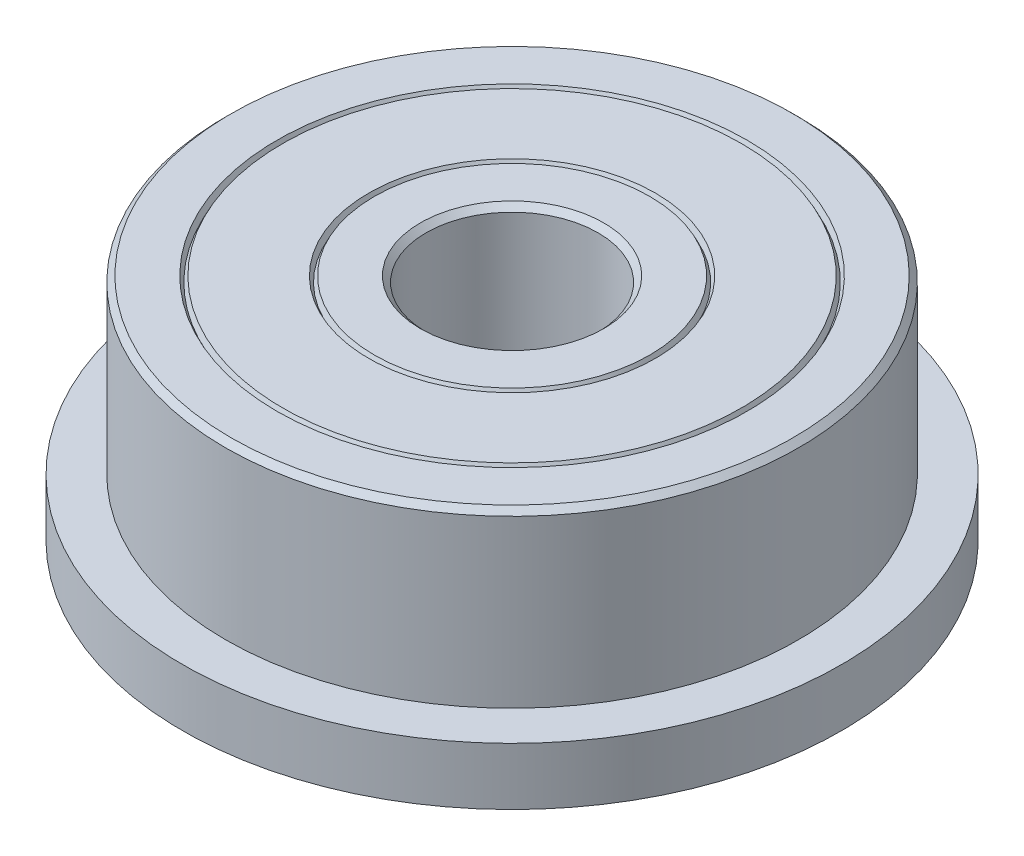
ISO-10303-21;
HEADER;
FILE_DESCRIPTION(('STEP AP214'),'2;1');
FILE_NAME('part.step','',(''),(''),'','','');
FILE_SCHEMA(('AUTOMOTIVE_DESIGN { 1 0 10303 214 1 1 1 1 }'));
ENDSEC;
DATA;
#1=APPLICATION_CONTEXT('core data for automotive mechanical design processes');
#2=APPLICATION_PROTOCOL_DEFINITION('international standard','automotive_design',2000,#1);
#3=PRODUCT_CONTEXT('',#1,'mechanical');
#4=PRODUCT('Part','Part','',(#3));
#5=PRODUCT_RELATED_PRODUCT_CATEGORY('part','',(#4));
#6=PRODUCT_DEFINITION_FORMATION('','',#4);
#7=PRODUCT_DEFINITION_CONTEXT('part definition',#1,'design');
#8=PRODUCT_DEFINITION('design','',#6,#7);
#9=PRODUCT_DEFINITION_SHAPE('','',#8);
#10=(LENGTH_UNIT() NAMED_UNIT(*) SI_UNIT(.MILLI.,.METRE.));
#11=(NAMED_UNIT(*) PLANE_ANGLE_UNIT() SI_UNIT($,.RADIAN.));
#12=(NAMED_UNIT(*) SI_UNIT($,.STERADIAN.) SOLID_ANGLE_UNIT());
#13=UNCERTAINTY_MEASURE_WITH_UNIT(LENGTH_MEASURE(1.E-05),#10,'distance_accuracy_value','');
#14=(GEOMETRIC_REPRESENTATION_CONTEXT(3) GLOBAL_UNCERTAINTY_ASSIGNED_CONTEXT((#13)) GLOBAL_UNIT_ASSIGNED_CONTEXT((#10,
#11,#12)) REPRESENTATION_CONTEXT('',''));
#15=CARTESIAN_POINT('',(0.,0.,0.));
#16=DIRECTION('',(0.,0.,1.));
#17=DIRECTION('',(1.,0.,0.));
#18=AXIS2_PLACEMENT_3D('',#15,#16,#17);
#19=CARTESIAN_POINT('',(0.,-2.,0.));
#20=DIRECTION('',(0.,-1.,0.));
#21=DIRECTION('',(0.,0.,-1.));
#22=AXIS2_PLACEMENT_3D('',#19,#20,#21);
#23=CYLINDRICAL_SURFACE('',#22,1.5);
#24=CARTESIAN_POINT('',(0.,-1.9,0.));
#25=DIRECTION('',(0.,-1.,0.));
#26=DIRECTION('',(0.,0.,-1.));
#27=AXIS2_PLACEMENT_3D('',#24,#25,#26);
#28=CIRCLE('',#27,1.5);
#29=CARTESIAN_POINT('',(0.,-1.9,-1.5));
#30=VERTEX_POINT('',#29);
#31=EDGE_CURVE('E54',#30,#30,#28,.T.);
#32=ORIENTED_EDGE('',*,*,#31,.T.);
#33=EDGE_LOOP('',(#32));
#34=FACE_BOUND('',#33,.T.);
#35=CARTESIAN_POINT('',(0.,1.9,0.));
#36=DIRECTION('',(0.,1.,0.));
#37=DIRECTION('',(0.,0.,1.));
#38=AXIS2_PLACEMENT_3D('',#35,#36,#37);
#39=CIRCLE('',#38,1.5);
#40=CARTESIAN_POINT('',(0.,1.9,1.5));
#41=VERTEX_POINT('',#40);
#42=EDGE_CURVE('E57',#41,#41,#39,.T.);
#43=ORIENTED_EDGE('',*,*,#42,.T.);
#44=EDGE_LOOP('',(#43));
#45=FACE_BOUND('',#44,.T.);
#46=ADVANCED_FACE('F34',(#34,#45),#23,.F.);
#47=CARTESIAN_POINT('',(0.,-2.,-1.5));
#48=DIRECTION('',(0.,-1.,0.));
#49=DIRECTION('',(0.,0.,-1.));
#50=AXIS2_PLACEMENT_3D('',#47,#48,#49);
#51=PLANE('',#50);
#52=CARTESIAN_POINT('',(0.,-2.,0.));
#53=DIRECTION('',(0.,-1.,0.));
#54=DIRECTION('',(0.,0.,-1.));
#55=AXIS2_PLACEMENT_3D('',#52,#53,#54);
#56=CIRCLE('',#55,1.6);
#57=CARTESIAN_POINT('',(0.,-2.,-1.6));
#58=VERTEX_POINT('',#57);
#59=EDGE_CURVE('E49',#58,#58,#56,.F.);
#60=ORIENTED_EDGE('',*,*,#59,.T.);
#61=EDGE_LOOP('',(#60));
#62=FACE_BOUND('',#61,.T.);
#63=CARTESIAN_POINT('',(0.,-2.,0.));
#64=DIRECTION('',(0.,-1.,0.));
#65=DIRECTION('',(0.,0.,-1.));
#66=AXIS2_PLACEMENT_3D('',#63,#64,#65);
#67=CIRCLE('',#66,2.4003508864483);
#68=CARTESIAN_POINT('',(0.,-2.,-2.4003508864483));
#69=VERTEX_POINT('',#68);
#70=EDGE_CURVE('E60',#69,#69,#67,.T.);
#71=ORIENTED_EDGE('',*,*,#70,.T.);
#72=EDGE_LOOP('',(#71));
#73=FACE_BOUND('',#72,.T.);
#74=ADVANCED_FACE('F123',(#62,#73),#51,.T.);
#75=CARTESIAN_POINT('',(0.,-1.9,0.));
#76=DIRECTION('',(0.,1.,0.));
#77=DIRECTION('',(0.,0.,1.));
#78=AXIS2_PLACEMENT_3D('',#75,#76,#77);
#79=CONICAL_SURFACE('',#78,2.4503508864483,0.463647609000808);
#80=ORIENTED_EDGE('',*,*,#70,.F.);
#81=EDGE_LOOP('',(#80));
#82=FACE_BOUND('',#81,.T.);
#83=CARTESIAN_POINT('',(0.,-1.9,0.));
#84=DIRECTION('',(0.,-1.,0.));
#85=DIRECTION('',(0.,0.,-1.));
#86=AXIS2_PLACEMENT_3D('',#83,#84,#85);
#87=CIRCLE('',#86,2.4503508864483);
#88=CARTESIAN_POINT('',(0.,-1.9,-2.4503508864483));
#89=VERTEX_POINT('',#88);
#90=EDGE_CURVE('E63',#89,#89,#87,.T.);
#91=ORIENTED_EDGE('',*,*,#90,.T.);
#92=EDGE_LOOP('',(#91));
#93=FACE_BOUND('',#92,.T.);
#94=ADVANCED_FACE('F129',(#82,#93),#79,.T.);
#95=CARTESIAN_POINT('',(0.,-2.,0.));
#96=DIRECTION('',(0.,-1.,0.));
#97=DIRECTION('',(0.,0.,-1.));
#98=AXIS2_PLACEMENT_3D('',#95,#96,#97);
#99=CONICAL_SURFACE('',#98,2.5003508864483,0.463647609000804);
#100=ORIENTED_EDGE('',*,*,#90,.F.);
#101=EDGE_LOOP('',(#100));
#102=FACE_BOUND('',#101,.T.);
#103=CARTESIAN_POINT('',(0.,-2.,0.));
#104=DIRECTION('',(0.,-1.,0.));
#105=DIRECTION('',(0.,0.,-1.));
#106=AXIS2_PLACEMENT_3D('',#103,#104,#105);
#107=CIRCLE('',#106,2.5003508864483);
#108=CARTESIAN_POINT('',(0.,-2.,-2.5003508864483));
#109=VERTEX_POINT('',#108);
#110=EDGE_CURVE('E66',#109,#109,#107,.T.);
#111=ORIENTED_EDGE('',*,*,#110,.T.);
#112=EDGE_LOOP('',(#111));
#113=FACE_BOUND('',#112,.T.);
#114=ADVANCED_FACE('F178',(#102,#113),#99,.F.);
#115=CARTESIAN_POINT('',(0.,-2.,-2.5003508864483));
#116=DIRECTION('',(0.,-1.,0.));
#117=DIRECTION('',(0.,0.,-1.));
#118=AXIS2_PLACEMENT_3D('',#115,#116,#117);
#119=PLANE('',#118);
#120=CARTESIAN_POINT('',(0.,-2.,0.));
#121=DIRECTION('',(0.,-1.,0.));
#122=DIRECTION('',(0.,0.,-1.));
#123=AXIS2_PLACEMENT_3D('',#120,#121,#122);
#124=CIRCLE('',#123,3.9996491135517);
#125=CARTESIAN_POINT('',(0.,-2.,-3.9996491135517));
#126=VERTEX_POINT('',#125);
#127=EDGE_CURVE('E69',#126,#126,#124,.T.);
#128=ORIENTED_EDGE('',*,*,#127,.T.);
#129=EDGE_LOOP('',(#128));
#130=FACE_BOUND('',#129,.T.);
#131=ORIENTED_EDGE('',*,*,#110,.F.);
#132=EDGE_LOOP('',(#131));
#133=FACE_BOUND('',#132,.T.);
#134=ADVANCED_FACE('F174',(#130,#133),#119,.T.);
#135=CARTESIAN_POINT('',(0.,-2.,0.));
#136=DIRECTION('',(0.,1.,0.));
#137=DIRECTION('',(0.,0.,1.));
#138=AXIS2_PLACEMENT_3D('',#135,#136,#137);
#139=CONICAL_SURFACE('',#138,3.9996491135517,0.463647609000806);
#140=CARTESIAN_POINT('',(0.,-1.9,0.));
#141=DIRECTION('',(0.,-1.,0.));
#142=DIRECTION('',(0.,0.,-1.));
#143=AXIS2_PLACEMENT_3D('',#140,#141,#142);
#144=CIRCLE('',#143,4.0496491135517);
#145=CARTESIAN_POINT('',(0.,-1.9,-4.0496491135517));
#146=VERTEX_POINT('',#145);
#147=EDGE_CURVE('E72',#146,#146,#144,.T.);
#148=ORIENTED_EDGE('',*,*,#147,.T.);
#149=EDGE_LOOP('',(#148));
#150=FACE_BOUND('',#149,.T.);
#151=ORIENTED_EDGE('',*,*,#127,.F.);
#152=EDGE_LOOP('',(#151));
#153=FACE_BOUND('',#152,.T.);
#154=ADVANCED_FACE('F170',(#150,#153),#139,.T.);
#155=CARTESIAN_POINT('',(0.,-1.9,0.));
#156=DIRECTION('',(0.,-1.,0.));
#157=DIRECTION('',(0.,0.,-1.));
#158=AXIS2_PLACEMENT_3D('',#155,#156,#157);
#159=CONICAL_SURFACE('',#158,4.0496491135517,0.463647609000806);
#160=CARTESIAN_POINT('',(0.,-2.,0.));
#161=DIRECTION('',(0.,-1.,0.));
#162=DIRECTION('',(0.,0.,-1.));
#163=AXIS2_PLACEMENT_3D('',#160,#161,#162);
#164=CIRCLE('',#163,4.0996491135517);
#165=CARTESIAN_POINT('',(0.,-2.,-4.0996491135517));
#166=VERTEX_POINT('',#165);
#167=EDGE_CURVE('E75',#166,#166,#164,.T.);
#168=ORIENTED_EDGE('',*,*,#167,.T.);
#169=EDGE_LOOP('',(#168));
#170=FACE_BOUND('',#169,.T.);
#171=ORIENTED_EDGE('',*,*,#147,.F.);
#172=EDGE_LOOP('',(#171));
#173=FACE_BOUND('',#172,.T.);
#174=ADVANCED_FACE('F166',(#170,#173),#159,.F.);
#175=CARTESIAN_POINT('',(0.,-2.,-4.0996491135517));
#176=DIRECTION('',(0.,-1.,0.));
#177=DIRECTION('',(0.,0.,-1.));
#178=AXIS2_PLACEMENT_3D('',#175,#176,#177);
#179=PLANE('',#178);
#180=CARTESIAN_POINT('',(0.,-2.,0.));
#181=DIRECTION('',(0.,-1.,0.));
#182=DIRECTION('',(0.,0.,-1.));
#183=AXIS2_PLACEMENT_3D('',#180,#181,#182);
#184=CIRCLE('',#183,5.75);
#185=CARTESIAN_POINT('',(0.,-2.,-5.75));
#186=VERTEX_POINT('',#185);
#187=EDGE_CURVE('E78',#186,#186,#184,.T.);
#188=ORIENTED_EDGE('',*,*,#187,.T.);
#189=EDGE_LOOP('',(#188));
#190=FACE_BOUND('',#189,.T.);
#191=ORIENTED_EDGE('',*,*,#167,.F.);
#192=EDGE_LOOP('',(#191));
#193=FACE_BOUND('',#192,.T.);
#194=ADVANCED_FACE('F158',(#190,#193),#179,.T.);
#195=CARTESIAN_POINT('',(0.,-2.,0.));
#196=DIRECTION('',(0.,-1.,0.));
#197=DIRECTION('',(0.,0.,-1.));
#198=AXIS2_PLACEMENT_3D('',#195,#196,#197);
#199=CYLINDRICAL_SURFACE('',#198,5.75);
#200=CARTESIAN_POINT('',(0.,-1.,0.));
#201=DIRECTION('',(0.,-1.,0.));
#202=DIRECTION('',(0.,0.,-1.));
#203=AXIS2_PLACEMENT_3D('',#200,#201,#202);
#204=CIRCLE('',#203,5.75);
#205=CARTESIAN_POINT('',(0.,-1.,-5.75));
#206=VERTEX_POINT('',#205);
#207=EDGE_CURVE('E81',#206,#206,#204,.T.);
#208=ORIENTED_EDGE('',*,*,#207,.T.);
#209=EDGE_LOOP('',(#208));
#210=FACE_BOUND('',#209,.T.);
#211=ORIENTED_EDGE('',*,*,#187,.F.);
#212=EDGE_LOOP('',(#211));
#213=FACE_BOUND('',#212,.T.);
#214=ADVANCED_FACE('F152',(#210,#213),#199,.T.);
#215=CARTESIAN_POINT('',(0.,-1.,-5.));
#216=DIRECTION('',(0.,-1.,0.));
#217=DIRECTION('',(0.,0.,-1.));
#218=AXIS2_PLACEMENT_3D('',#215,#216,#217);
#219=PLANE('',#218);
#220=ORIENTED_EDGE('',*,*,#207,.F.);
#221=EDGE_LOOP('',(#220));
#222=FACE_BOUND('',#221,.T.);
#223=CARTESIAN_POINT('',(0.,-1.,0.));
#224=DIRECTION('',(0.,-1.,0.));
#225=DIRECTION('',(0.,0.,-1.));
#226=AXIS2_PLACEMENT_3D('',#223,#224,#225);
#227=CIRCLE('',#226,5.);
#228=CARTESIAN_POINT('',(0.,-1.,-5.));
#229=VERTEX_POINT('',#228);
#230=EDGE_CURVE('E84',#229,#229,#227,.T.);
#231=ORIENTED_EDGE('',*,*,#230,.T.);
#232=EDGE_LOOP('',(#231));
#233=FACE_BOUND('',#232,.T.);
#234=ADVANCED_FACE('F147',(#222,#233),#219,.F.);
#235=CARTESIAN_POINT('',(0.,-2.,0.));
#236=DIRECTION('',(0.,-1.,0.));
#237=DIRECTION('',(0.,0.,-1.));
#238=AXIS2_PLACEMENT_3D('',#235,#236,#237);
#239=CYLINDRICAL_SURFACE('',#238,5.);
#240=CARTESIAN_POINT('',(0.,1.9,0.));
#241=DIRECTION('',(0.,1.,0.));
#242=DIRECTION('',(0.,0.,1.));
#243=AXIS2_PLACEMENT_3D('',#240,#241,#242);
#244=CIRCLE('',#243,5.);
#245=CARTESIAN_POINT('',(0.,1.9,5.));
#246=VERTEX_POINT('',#245);
#247=EDGE_CURVE('E45',#246,#246,#244,.F.);
#248=ORIENTED_EDGE('',*,*,#247,.T.);
#249=EDGE_LOOP('',(#248));
#250=FACE_BOUND('',#249,.T.);
#251=ORIENTED_EDGE('',*,*,#230,.F.);
#252=EDGE_LOOP('',(#251));
#253=FACE_BOUND('',#252,.T.);
#254=ADVANCED_FACE('F143',(#250,#253),#239,.T.);
#255=CARTESIAN_POINT('',(0.,2.,-5.));
#256=DIRECTION('',(0.,1.,0.));
#257=DIRECTION('',(0.,0.,1.));
#258=AXIS2_PLACEMENT_3D('',#255,#256,#257);
#259=PLANE('',#258);
#260=CARTESIAN_POINT('',(0.,2.,0.));
#261=DIRECTION('',(0.,1.,0.));
#262=DIRECTION('',(0.,0.,1.));
#263=AXIS2_PLACEMENT_3D('',#260,#261,#262);
#264=CIRCLE('',#263,4.9);
#265=CARTESIAN_POINT('',(0.,2.,4.9));
#266=VERTEX_POINT('',#265);
#267=EDGE_CURVE('E41',#266,#266,#264,.T.);
#268=ORIENTED_EDGE('',*,*,#267,.T.);
#269=EDGE_LOOP('',(#268));
#270=FACE_BOUND('',#269,.T.);
#271=CARTESIAN_POINT('',(0.,2.,0.));
#272=DIRECTION('',(0.,-1.,0.));
#273=DIRECTION('',(0.,0.,-1.));
#274=AXIS2_PLACEMENT_3D('',#271,#272,#273);
#275=CIRCLE('',#274,4.0996491135517);
#276=CARTESIAN_POINT('',(0.,2.,-4.0996491135517));
#277=VERTEX_POINT('',#276);
#278=EDGE_CURVE('E87',#277,#277,#275,.T.);
#279=ORIENTED_EDGE('',*,*,#278,.T.);
#280=EDGE_LOOP('',(#279));
#281=FACE_BOUND('',#280,.T.);
#282=ADVANCED_FACE('F146',(#270,#281),#259,.T.);
#283=CARTESIAN_POINT('',(0.,1.9,0.));
#284=DIRECTION('',(0.,1.,0.));
#285=DIRECTION('',(0.,0.,1.));
#286=AXIS2_PLACEMENT_3D('',#283,#284,#285);
#287=CONICAL_SURFACE('',#286,4.0496491135517,0.463647609000808);
#288=ORIENTED_EDGE('',*,*,#278,.F.);
#289=EDGE_LOOP('',(#288));
#290=FACE_BOUND('',#289,.T.);
#291=CARTESIAN_POINT('',(0.,1.9,0.));
#292=DIRECTION('',(0.,-1.,0.));
#293=DIRECTION('',(0.,0.,-1.));
#294=AXIS2_PLACEMENT_3D('',#291,#292,#293);
#295=CIRCLE('',#294,4.0496491135517);
#296=CARTESIAN_POINT('',(0.,1.9,-4.0496491135517));
#297=VERTEX_POINT('',#296);
#298=EDGE_CURVE('E90',#297,#297,#295,.T.);
#299=ORIENTED_EDGE('',*,*,#298,.T.);
#300=EDGE_LOOP('',(#299));
#301=FACE_BOUND('',#300,.T.);
#302=ADVANCED_FACE('F229',(#290,#301),#287,.F.);
#303=CARTESIAN_POINT('',(0.,2.,0.));
#304=DIRECTION('',(0.,-1.,0.));
#305=DIRECTION('',(0.,0.,-1.));
#306=AXIS2_PLACEMENT_3D('',#303,#304,#305);
#307=CONICAL_SURFACE('',#306,3.9996491135517,0.463647609000808);
#308=ORIENTED_EDGE('',*,*,#298,.F.);
#309=EDGE_LOOP('',(#308));
#310=FACE_BOUND('',#309,.T.);
#311=CARTESIAN_POINT('',(0.,2.,0.));
#312=DIRECTION('',(0.,-1.,0.));
#313=DIRECTION('',(0.,0.,-1.));
#314=AXIS2_PLACEMENT_3D('',#311,#312,#313);
#315=CIRCLE('',#314,3.9996491135517);
#316=CARTESIAN_POINT('',(0.,2.,-3.9996491135517));
#317=VERTEX_POINT('',#316);
#318=EDGE_CURVE('E93',#317,#317,#315,.T.);
#319=ORIENTED_EDGE('',*,*,#318,.T.);
#320=EDGE_LOOP('',(#319));
#321=FACE_BOUND('',#320,.T.);
#322=ADVANCED_FACE('F234',(#310,#321),#307,.T.);
#323=CARTESIAN_POINT('',(0.,2.,-3.9996491135517));
#324=DIRECTION('',(0.,1.,0.));
#325=DIRECTION('',(0.,0.,1.));
#326=AXIS2_PLACEMENT_3D('',#323,#324,#325);
#327=PLANE('',#326);
#328=CARTESIAN_POINT('',(0.,2.,0.));
#329=DIRECTION('',(0.,-1.,0.));
#330=DIRECTION('',(0.,0.,-1.));
#331=AXIS2_PLACEMENT_3D('',#328,#329,#330);
#332=CIRCLE('',#331,2.5003508864483);
#333=CARTESIAN_POINT('',(0.,2.,-2.5003508864483));
#334=VERTEX_POINT('',#333);
#335=EDGE_CURVE('E96',#334,#334,#332,.T.);
#336=ORIENTED_EDGE('',*,*,#335,.T.);
#337=EDGE_LOOP('',(#336));
#338=FACE_BOUND('',#337,.T.);
#339=ORIENTED_EDGE('',*,*,#318,.F.);
#340=EDGE_LOOP('',(#339));
#341=FACE_BOUND('',#340,.T.);
#342=ADVANCED_FACE('F246',(#338,#341),#327,.T.);
#343=CARTESIAN_POINT('',(0.,2.,0.));
#344=DIRECTION('',(0.,1.,0.));
#345=DIRECTION('',(0.,0.,1.));
#346=AXIS2_PLACEMENT_3D('',#343,#344,#345);
#347=CONICAL_SURFACE('',#346,2.5003508864483,0.463647609000804);
#348=CARTESIAN_POINT('',(0.,1.9,0.));
#349=DIRECTION('',(0.,-1.,0.));
#350=DIRECTION('',(0.,0.,-1.));
#351=AXIS2_PLACEMENT_3D('',#348,#349,#350);
#352=CIRCLE('',#351,2.4503508864483);
#353=CARTESIAN_POINT('',(0.,1.9,-2.4503508864483));
#354=VERTEX_POINT('',#353);
#355=EDGE_CURVE('E99',#354,#354,#352,.T.);
#356=ORIENTED_EDGE('',*,*,#355,.T.);
#357=EDGE_LOOP('',(#356));
#358=FACE_BOUND('',#357,.T.);
#359=ORIENTED_EDGE('',*,*,#335,.F.);
#360=EDGE_LOOP('',(#359));
#361=FACE_BOUND('',#360,.T.);
#362=ADVANCED_FACE('F120',(#358,#361),#347,.F.);
#363=CARTESIAN_POINT('',(0.,1.9,0.));
#364=DIRECTION('',(0.,-1.,0.));
#365=DIRECTION('',(0.,0.,-1.));
#366=AXIS2_PLACEMENT_3D('',#363,#364,#365);
#367=CONICAL_SURFACE('',#366,2.4503508864483,0.463647609000808);
#368=CARTESIAN_POINT('',(0.,2.,0.));
#369=DIRECTION('',(0.,-1.,0.));
#370=DIRECTION('',(0.,0.,-1.));
#371=AXIS2_PLACEMENT_3D('',#368,#369,#370);
#372=CIRCLE('',#371,2.4003508864483);
#373=CARTESIAN_POINT('',(0.,2.,-2.4003508864483));
#374=VERTEX_POINT('',#373);
#375=EDGE_CURVE('E102',#374,#374,#372,.T.);
#376=ORIENTED_EDGE('',*,*,#375,.T.);
#377=EDGE_LOOP('',(#376));
#378=FACE_BOUND('',#377,.T.);
#379=ORIENTED_EDGE('',*,*,#355,.F.);
#380=EDGE_LOOP('',(#379));
#381=FACE_BOUND('',#380,.T.);
#382=ADVANCED_FACE('F106',(#378,#381),#367,.T.);
#383=CARTESIAN_POINT('',(0.,2.,-2.4003508864483));
#384=DIRECTION('',(0.,1.,0.));
#385=DIRECTION('',(0.,0.,1.));
#386=AXIS2_PLACEMENT_3D('',#383,#384,#385);
#387=PLANE('',#386);
#388=CARTESIAN_POINT('',(0.,2.,0.));
#389=DIRECTION('',(0.,1.,0.));
#390=DIRECTION('',(0.,0.,1.));
#391=AXIS2_PLACEMENT_3D('',#388,#389,#390);
#392=CIRCLE('',#391,1.6);
#393=CARTESIAN_POINT('',(0.,2.,1.6));
#394=VERTEX_POINT('',#393);
#395=EDGE_CURVE('E10',#394,#394,#392,.F.);
#396=ORIENTED_EDGE('',*,*,#395,.T.);
#397=EDGE_LOOP('',(#396));
#398=FACE_BOUND('',#397,.T.);
#399=ORIENTED_EDGE('',*,*,#375,.F.);
#400=EDGE_LOOP('',(#399));
#401=FACE_BOUND('',#400,.T.);
#402=ADVANCED_FACE('F109',(#398,#401),#387,.T.);
#403=CARTESIAN_POINT('',(0.,-1.9,0.));
#404=DIRECTION('',(0.,-1.,0.));
#405=DIRECTION('',(0.,0.,-1.));
#406=AXIS2_PLACEMENT_3D('',#403,#404,#405);
#407=CONICAL_SURFACE('',#406,1.5,0.785398163397453);
#408=ORIENTED_EDGE('',*,*,#59,.F.);
#409=EDGE_LOOP('',(#408));
#410=FACE_BOUND('',#409,.T.);
#411=ORIENTED_EDGE('',*,*,#31,.F.);
#412=EDGE_LOOP('',(#411));
#413=FACE_BOUND('',#412,.T.);
#414=ADVANCED_FACE('F111',(#410,#413),#407,.F.);
#415=CARTESIAN_POINT('',(0.,1.9,0.));
#416=DIRECTION('',(0.,-1.,0.));
#417=DIRECTION('',(0.,0.,-1.));
#418=AXIS2_PLACEMENT_3D('',#415,#416,#417);
#419=CONICAL_SURFACE('',#418,5.,0.785398163397448);
#420=ORIENTED_EDGE('',*,*,#267,.F.);
#421=EDGE_LOOP('',(#420));
#422=FACE_BOUND('',#421,.T.);
#423=ORIENTED_EDGE('',*,*,#247,.F.);
#424=EDGE_LOOP('',(#423));
#425=FACE_BOUND('',#424,.T.);
#426=ADVANCED_FACE('F117',(#422,#425),#419,.T.);
#427=CARTESIAN_POINT('',(0.,2.,0.));
#428=DIRECTION('',(0.,1.,0.));
#429=DIRECTION('',(0.,0.,1.));
#430=AXIS2_PLACEMENT_3D('',#427,#428,#429);
#431=CONICAL_SURFACE('',#430,1.6,0.785398163397443);
#432=ORIENTED_EDGE('',*,*,#42,.F.);
#433=EDGE_LOOP('',(#432));
#434=FACE_BOUND('',#433,.T.);
#435=ORIENTED_EDGE('',*,*,#395,.F.);
#436=EDGE_LOOP('',(#435));
#437=FACE_BOUND('',#436,.T.);
#438=ADVANCED_FACE('F36',(#434,#437),#431,.F.);
#439=CLOSED_SHELL('',(#46,#74,#94,#114,#134,#154,#174,#194,#214,#234,#254,#282,#302,#322,#342,
#362,#382,#402,#414,#426,#438));
#440=MANIFOLD_SOLID_BREP('B2',#439);
#441=ADVANCED_BREP_SHAPE_REPRESENTATION('',(#18,#440),#14);
#442=SHAPE_DEFINITION_REPRESENTATION(#9,#441);
ENDSEC;
END-ISO-10303-21;
